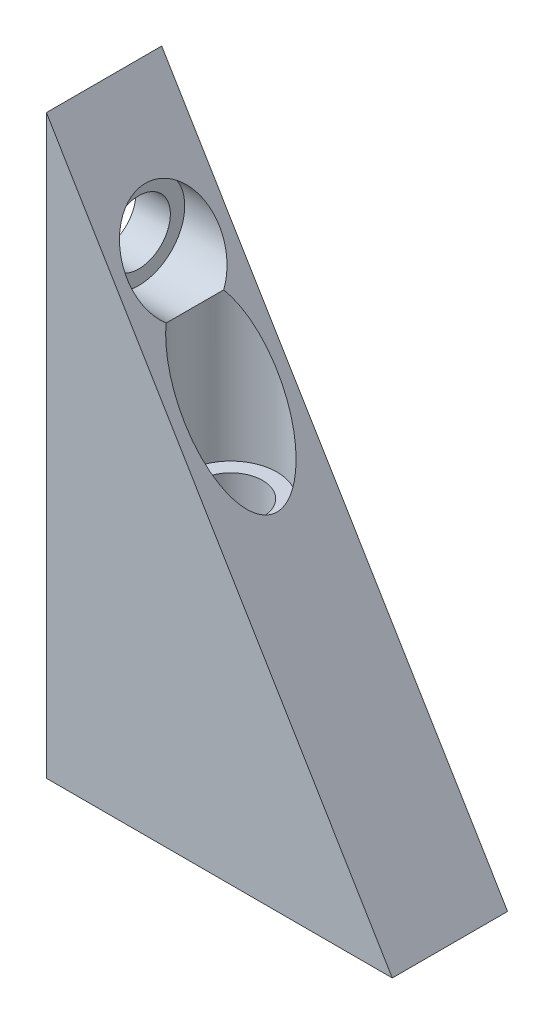
ISO-10303-21;
HEADER;
FILE_DESCRIPTION(('STEP AP214'),'2;1');
FILE_NAME('part.step','',(''),(''),'','','');
FILE_SCHEMA(('AUTOMOTIVE_DESIGN { 1 0 10303 214 1 1 1 1 }'));
ENDSEC;
DATA;
#1=APPLICATION_CONTEXT('core data for automotive mechanical design processes');
#2=APPLICATION_PROTOCOL_DEFINITION('international standard','automotive_design',2000,#1);
#3=PRODUCT_CONTEXT('',#1,'mechanical');
#4=PRODUCT('Part','Part','',(#3));
#5=PRODUCT_RELATED_PRODUCT_CATEGORY('part','',(#4));
#6=PRODUCT_DEFINITION_FORMATION('','',#4);
#7=PRODUCT_DEFINITION_CONTEXT('part definition',#1,'design');
#8=PRODUCT_DEFINITION('design','',#6,#7);
#9=PRODUCT_DEFINITION_SHAPE('','',#8);
#10=(LENGTH_UNIT() NAMED_UNIT(*) SI_UNIT(.MILLI.,.METRE.));
#11=(NAMED_UNIT(*) PLANE_ANGLE_UNIT() SI_UNIT($,.RADIAN.));
#12=(NAMED_UNIT(*) SI_UNIT($,.STERADIAN.) SOLID_ANGLE_UNIT());
#13=UNCERTAINTY_MEASURE_WITH_UNIT(LENGTH_MEASURE(1.E-05),#10,'distance_accuracy_value','');
#14=(GEOMETRIC_REPRESENTATION_CONTEXT(3) GLOBAL_UNCERTAINTY_ASSIGNED_CONTEXT((#13)) GLOBAL_UNIT_ASSIGNED_CONTEXT((#10,
#11,#12)) REPRESENTATION_CONTEXT('',''));
#15=CARTESIAN_POINT('',(0.,0.,0.));
#16=DIRECTION('',(0.,0.,1.));
#17=DIRECTION('',(1.,0.,0.));
#18=AXIS2_PLACEMENT_3D('',#15,#16,#17);
#19=CARTESIAN_POINT('',(11.,24.,5.));
#20=DIRECTION('',(0.,1.,0.));
#21=DIRECTION('',(0.,0.,1.));
#22=AXIS2_PLACEMENT_3D('',#19,#20,#21);
#23=CYLINDRICAL_SURFACE('',#22,4.);
#24=CARTESIAN_POINT('',(11.,24.,5.));
#25=DIRECTION('',(0.,-1.,0.));
#26=DIRECTION('',(0.,0.,-1.));
#27=AXIS2_PLACEMENT_3D('',#24,#25,#26);
#28=CIRCLE('',#27,4.);
#29=CARTESIAN_POINT('',(11.,24.,0.999999999999999));
#30=VERTEX_POINT('',#29);
#31=EDGE_CURVE('E93',#30,#30,#28,.T.);
#32=ORIENTED_EDGE('',*,*,#31,.T.);
#33=EDGE_LOOP('',(#32));
#34=FACE_BOUND('',#33,.T.);
#35=CARTESIAN_POINT('',(11.,31.6666666666667,5.));
#36=DIRECTION('',(-0.857492925712544,-0.514495755427526,0.));
#37=DIRECTION('',(-0.514495755427526,0.857492925712544,0.));
#38=AXIS2_PLACEMENT_3D('',#35,#36,#37);
#39=ELLIPSE('',#38,7.7746025264604,4.);
#40=CARTESIAN_POINT('',(7.875,36.875,7.49687304442978));
#41=VERTEX_POINT('',#40);
#42=CARTESIAN_POINT('',(7.875,36.875,2.50312695557022));
#43=VERTEX_POINT('',#42);
#44=EDGE_CURVE('E89',#41,#43,#39,.F.);
#45=ORIENTED_EDGE('',*,*,#44,.T.);
#46=CARTESIAN_POINT('',(11.,40.,5.));
#47=DIRECTION('',(-0.707106781186548,0.707106781186547,0.));
#48=DIRECTION('',(0.707106781186548,0.707106781186547,0.));
#49=AXIS2_PLACEMENT_3D('',#46,#47,#48);
#50=ELLIPSE('',#49,5.65685424949238,4.);
#51=EDGE_CURVE('E11',#43,#41,#50,.T.);
#52=ORIENTED_EDGE('',*,*,#51,.T.);
#53=EDGE_LOOP('',(#45,#52));
#54=FACE_BOUND('',#53,.T.);
#55=ADVANCED_FACE('F35',(#34,#54),#23,.F.);
#56=CARTESIAN_POINT('',(30.,40.,5.));
#57=DIRECTION('',(-1.,0.,0.));
#58=DIRECTION('',(0.,0.,1.));
#59=AXIS2_PLACEMENT_3D('',#56,#57,#58);
#60=CYLINDRICAL_SURFACE('',#59,2.75);
#61=CARTESIAN_POINT('',(2.99999999999999,40.,5.));
#62=DIRECTION('',(-1.,0.,0.));
#63=DIRECTION('',(0.,0.,1.));
#64=AXIS2_PLACEMENT_3D('',#61,#62,#63);
#65=CIRCLE('',#64,2.75);
#66=CARTESIAN_POINT('',(2.99999999999999,40.,7.75));
#67=VERTEX_POINT('',#66);
#68=EDGE_CURVE('E39',#67,#67,#65,.F.);
#69=ORIENTED_EDGE('',*,*,#68,.T.);
#70=EDGE_LOOP('',(#69));
#71=FACE_BOUND('',#70,.T.);
#72=CARTESIAN_POINT('',(0.,40.,5.));
#73=DIRECTION('',(-1.,0.,0.));
#74=DIRECTION('',(0.,0.,1.));
#75=AXIS2_PLACEMENT_3D('',#72,#73,#74);
#76=CIRCLE('',#75,2.75);
#77=CARTESIAN_POINT('',(0.,40.,7.75));
#78=VERTEX_POINT('',#77);
#79=EDGE_CURVE('E96',#78,#78,#76,.T.);
#80=ORIENTED_EDGE('',*,*,#79,.T.);
#81=EDGE_LOOP('',(#80));
#82=FACE_BOUND('',#81,.T.);
#83=ADVANCED_FACE('F141',(#71,#82),#60,.F.);
#84=CARTESIAN_POINT('',(30.,0.,10.));
#85=DIRECTION('',(0.,1.,0.));
#86=DIRECTION('',(0.,0.,1.));
#87=AXIS2_PLACEMENT_3D('',#84,#85,#86);
#88=PLANE('',#87);
#89=CARTESIAN_POINT('',(11.,0.,5.));
#90=DIRECTION('',(0.,-1.,0.));
#91=DIRECTION('',(0.,0.,-1.));
#92=AXIS2_PLACEMENT_3D('',#89,#90,#91);
#93=CIRCLE('',#92,2.75);
#94=CARTESIAN_POINT('',(11.,0.,2.25));
#95=VERTEX_POINT('',#94);
#96=EDGE_CURVE('E103',#95,#95,#93,.T.);
#97=ORIENTED_EDGE('',*,*,#96,.F.);
#98=EDGE_LOOP('',(#97));
#99=FACE_BOUND('',#98,.T.);
#100=DIRECTION('',(1.,0.,0.));
#101=VECTOR('',#100,1.);
#102=CARTESIAN_POINT('',(30.,0.,0.));
#103=LINE('',#102,#101);
#104=CARTESIAN_POINT('',(0.,0.,0.));
#105=VERTEX_POINT('',#104);
#106=CARTESIAN_POINT('',(30.,0.,0.));
#107=VERTEX_POINT('',#106);
#108=EDGE_CURVE('E106',#105,#107,#103,.T.);
#109=ORIENTED_EDGE('',*,*,#108,.T.);
#110=DIRECTION('',(0.,0.,-1.));
#111=VECTOR('',#110,1.);
#112=CARTESIAN_POINT('',(30.,0.,10.));
#113=LINE('',#112,#111);
#114=CARTESIAN_POINT('',(30.,0.,10.));
#115=VERTEX_POINT('',#114);
#116=EDGE_CURVE('E44',#115,#107,#113,.T.);
#117=ORIENTED_EDGE('',*,*,#116,.F.);
#118=DIRECTION('',(1.,0.,0.));
#119=VECTOR('',#118,1.);
#120=CARTESIAN_POINT('',(30.,0.,10.));
#121=LINE('',#120,#119);
#122=CARTESIAN_POINT('',(0.,0.,10.));
#123=VERTEX_POINT('',#122);
#124=EDGE_CURVE('E107',#123,#115,#121,.T.);
#125=ORIENTED_EDGE('',*,*,#124,.F.);
#126=DIRECTION('',(0.,0.,-1.));
#127=VECTOR('',#126,1.);
#128=CARTESIAN_POINT('',(0.,0.,10.));
#129=LINE('',#128,#127);
#130=EDGE_CURVE('E111',#123,#105,#129,.T.);
#131=ORIENTED_EDGE('',*,*,#130,.T.);
#132=EDGE_LOOP('',(#109,#117,#125,#131));
#133=FACE_BOUND('',#132,.T.);
#134=ADVANCED_FACE('F37',(#99,#133),#88,.F.);
#135=CARTESIAN_POINT('',(0.,50.,10.));
#136=DIRECTION('',(-0.857492925712544,-0.514495755427526,0.));
#137=DIRECTION('',(0.514495755427526,-0.857492925712544,0.));
#138=AXIS2_PLACEMENT_3D('',#135,#136,#137);
#139=PLANE('',#138);
#140=CARTESIAN_POINT('',(6.,40.,5.));
#141=DIRECTION('',(-0.857492925712544,-0.514495755427526,0.));
#142=DIRECTION('',(0.514495755427526,-0.857492925712544,0.));
#143=AXIS2_PLACEMENT_3D('',#140,#141,#142);
#144=ELLIPSE('',#143,4.66476151587624,4.);
#145=EDGE_CURVE('E50',#43,#41,#144,.F.);
#146=ORIENTED_EDGE('',*,*,#145,.F.);
#147=ORIENTED_EDGE('',*,*,#44,.F.);
#148=EDGE_LOOP('',(#146,#147));
#149=FACE_BOUND('',#148,.T.);
#150=DIRECTION('',(-0.514495755427526,0.857492925712544,0.));
#151=VECTOR('',#150,1.);
#152=CARTESIAN_POINT('',(0.,50.,0.));
#153=LINE('',#152,#151);
#154=CARTESIAN_POINT('',(0.,50.,0.));
#155=VERTEX_POINT('',#154);
#156=EDGE_CURVE('E114',#107,#155,#153,.T.);
#157=ORIENTED_EDGE('',*,*,#156,.T.);
#158=DIRECTION('',(0.,0.,-1.));
#159=VECTOR('',#158,1.);
#160=CARTESIAN_POINT('',(0.,50.,10.));
#161=LINE('',#160,#159);
#162=CARTESIAN_POINT('',(0.,50.,10.));
#163=VERTEX_POINT('',#162);
#164=EDGE_CURVE('E118',#163,#155,#161,.T.);
#165=ORIENTED_EDGE('',*,*,#164,.F.);
#166=DIRECTION('',(-0.514495755427526,0.857492925712544,0.));
#167=VECTOR('',#166,1.);
#168=CARTESIAN_POINT('',(0.,50.,10.));
#169=LINE('',#168,#167);
#170=EDGE_CURVE('E81',#115,#163,#169,.T.);
#171=ORIENTED_EDGE('',*,*,#170,.F.);
#172=ORIENTED_EDGE('',*,*,#116,.T.);
#173=EDGE_LOOP('',(#157,#165,#171,#172));
#174=FACE_BOUND('',#173,.T.);
#175=ADVANCED_FACE('F88',(#149,#174),#139,.F.);
#176=CARTESIAN_POINT('',(0.,0.,10.));
#177=DIRECTION('',(1.,0.,0.));
#178=DIRECTION('',(0.,0.,-1.));
#179=AXIS2_PLACEMENT_3D('',#176,#177,#178);
#180=PLANE('',#179);
#181=ORIENTED_EDGE('',*,*,#79,.F.);
#182=EDGE_LOOP('',(#181));
#183=FACE_BOUND('',#182,.T.);
#184=DIRECTION('',(0.,-1.,0.));
#185=VECTOR('',#184,1.);
#186=CARTESIAN_POINT('',(0.,0.,0.));
#187=LINE('',#186,#185);
#188=EDGE_CURVE('E75',#155,#105,#187,.T.);
#189=ORIENTED_EDGE('',*,*,#188,.T.);
#190=ORIENTED_EDGE('',*,*,#130,.F.);
#191=DIRECTION('',(0.,-1.,0.));
#192=VECTOR('',#191,1.);
#193=CARTESIAN_POINT('',(0.,0.,10.));
#194=LINE('',#193,#192);
#195=EDGE_CURVE('E58',#163,#123,#194,.T.);
#196=ORIENTED_EDGE('',*,*,#195,.F.);
#197=ORIENTED_EDGE('',*,*,#164,.T.);
#198=EDGE_LOOP('',(#189,#190,#196,#197));
#199=FACE_BOUND('',#198,.T.);
#200=ADVANCED_FACE('F137',(#183,#199),#180,.F.);
#201=CARTESIAN_POINT('',(0.,0.,10.));
#202=DIRECTION('',(0.,0.,-1.));
#203=DIRECTION('',(-1.,0.,0.));
#204=AXIS2_PLACEMENT_3D('',#201,#202,#203);
#205=PLANE('',#204);
#206=ORIENTED_EDGE('',*,*,#124,.T.);
#207=ORIENTED_EDGE('',*,*,#170,.T.);
#208=ORIENTED_EDGE('',*,*,#195,.T.);
#209=EDGE_LOOP('',(#206,#207,#208));
#210=FACE_BOUND('',#209,.T.);
#211=ADVANCED_FACE('F128',(#210),#205,.F.);
#212=CARTESIAN_POINT('',(0.,0.,0.));
#213=DIRECTION('',(0.,0.,-1.));
#214=DIRECTION('',(-1.,0.,0.));
#215=AXIS2_PLACEMENT_3D('',#212,#213,#214);
#216=PLANE('',#215);
#217=ORIENTED_EDGE('',*,*,#108,.F.);
#218=ORIENTED_EDGE('',*,*,#188,.F.);
#219=ORIENTED_EDGE('',*,*,#156,.F.);
#220=EDGE_LOOP('',(#217,#218,#219));
#221=FACE_BOUND('',#220,.T.);
#222=ADVANCED_FACE('F125',(#221),#216,.T.);
#223=CARTESIAN_POINT('',(11.,50.,5.));
#224=DIRECTION('',(0.,-1.,0.));
#225=DIRECTION('',(0.,0.,-1.));
#226=AXIS2_PLACEMENT_3D('',#223,#224,#225);
#227=CYLINDRICAL_SURFACE('',#226,2.75);
#228=CARTESIAN_POINT('',(11.,24.,5.));
#229=DIRECTION('',(0.,-1.,0.));
#230=DIRECTION('',(0.,0.,-1.));
#231=AXIS2_PLACEMENT_3D('',#228,#229,#230);
#232=CIRCLE('',#231,2.75);
#233=CARTESIAN_POINT('',(11.,24.,2.25));
#234=VERTEX_POINT('',#233);
#235=EDGE_CURVE('E92',#234,#234,#232,.F.);
#236=ORIENTED_EDGE('',*,*,#235,.T.);
#237=EDGE_LOOP('',(#236));
#238=FACE_BOUND('',#237,.T.);
#239=ORIENTED_EDGE('',*,*,#96,.T.);
#240=EDGE_LOOP('',(#239));
#241=FACE_BOUND('',#240,.T.);
#242=ADVANCED_FACE('F127',(#238,#241),#227,.F.);
#243=CARTESIAN_POINT('',(11.,24.,5.));
#244=DIRECTION('',(0.,-1.,0.));
#245=DIRECTION('',(0.,0.,-1.));
#246=AXIS2_PLACEMENT_3D('',#243,#244,#245);
#247=PLANE('',#246);
#248=ORIENTED_EDGE('',*,*,#31,.F.);
#249=EDGE_LOOP('',(#248));
#250=FACE_BOUND('',#249,.T.);
#251=ORIENTED_EDGE('',*,*,#235,.F.);
#252=EDGE_LOOP('',(#251));
#253=FACE_BOUND('',#252,.T.);
#254=ADVANCED_FACE('F134',(#250,#253),#247,.F.);
#255=CARTESIAN_POINT('',(2.99999999999999,40.,5.));
#256=DIRECTION('',(-1.,0.,0.));
#257=DIRECTION('',(0.,0.,1.));
#258=AXIS2_PLACEMENT_3D('',#255,#256,#257);
#259=PLANE('',#258);
#260=CARTESIAN_POINT('',(2.99999999999999,40.,5.));
#261=DIRECTION('',(-1.,0.,0.));
#262=DIRECTION('',(0.,0.,1.));
#263=AXIS2_PLACEMENT_3D('',#260,#261,#262);
#264=CIRCLE('',#263,4.);
#265=CARTESIAN_POINT('',(2.99999999999999,40.,9.));
#266=VERTEX_POINT('',#265);
#267=EDGE_CURVE('E90',#266,#266,#264,.T.);
#268=ORIENTED_EDGE('',*,*,#267,.F.);
#269=EDGE_LOOP('',(#268));
#270=FACE_BOUND('',#269,.T.);
#271=ORIENTED_EDGE('',*,*,#68,.F.);
#272=EDGE_LOOP('',(#271));
#273=FACE_BOUND('',#272,.T.);
#274=ADVANCED_FACE('F152',(#270,#273),#259,.F.);
#275=CARTESIAN_POINT('',(2.99999999999999,40.,5.));
#276=DIRECTION('',(1.,0.,0.));
#277=DIRECTION('',(0.,0.,-1.));
#278=AXIS2_PLACEMENT_3D('',#275,#276,#277);
#279=CYLINDRICAL_SURFACE('',#278,4.);
#280=ORIENTED_EDGE('',*,*,#267,.T.);
#281=EDGE_LOOP('',(#280));
#282=FACE_BOUND('',#281,.T.);
#283=ORIENTED_EDGE('',*,*,#145,.T.);
#284=ORIENTED_EDGE('',*,*,#51,.F.);
#285=EDGE_LOOP('',(#283,#284));
#286=FACE_BOUND('',#285,.T.);
#287=ADVANCED_FACE('F83',(#282,#286),#279,.F.);
#288=CLOSED_SHELL('',(#55,#83,#134,#175,#200,#211,#222,#242,#254,#274,#287));
#289=MANIFOLD_SOLID_BREP('B2',#288);
#290=ADVANCED_BREP_SHAPE_REPRESENTATION('',(#18,#289),#14);
#291=SHAPE_DEFINITION_REPRESENTATION(#9,#290);
ENDSEC;
END-ISO-10303-21;
